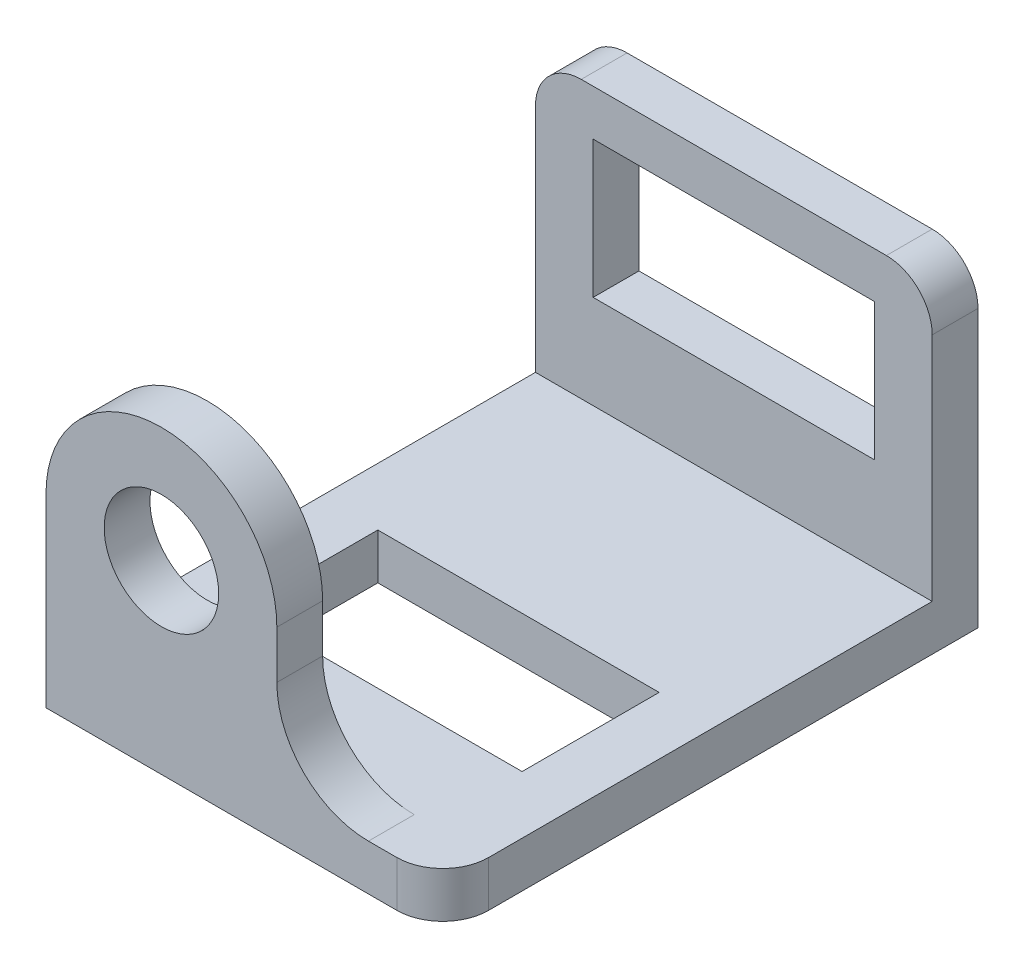
ISO-10303-21;
HEADER;
FILE_DESCRIPTION(('STEP AP214'),'2;1');
FILE_NAME('part.step','',(''),(''),'','','');
FILE_SCHEMA(('AUTOMOTIVE_DESIGN { 1 0 10303 214 1 1 1 1 }'));
ENDSEC;
DATA;
#1=APPLICATION_CONTEXT('core data for automotive mechanical design processes');
#2=APPLICATION_PROTOCOL_DEFINITION('international standard','automotive_design',2000,#1);
#3=PRODUCT_CONTEXT('',#1,'mechanical');
#4=PRODUCT('Part','Part','',(#3));
#5=PRODUCT_RELATED_PRODUCT_CATEGORY('part','',(#4));
#6=PRODUCT_DEFINITION_FORMATION('','',#4);
#7=PRODUCT_DEFINITION_CONTEXT('part definition',#1,'design');
#8=PRODUCT_DEFINITION('design','',#6,#7);
#9=PRODUCT_DEFINITION_SHAPE('','',#8);
#10=(LENGTH_UNIT() NAMED_UNIT(*) SI_UNIT(.MILLI.,.METRE.));
#11=(NAMED_UNIT(*) PLANE_ANGLE_UNIT() SI_UNIT($,.RADIAN.));
#12=(NAMED_UNIT(*) SI_UNIT($,.STERADIAN.) SOLID_ANGLE_UNIT());
#13=UNCERTAINTY_MEASURE_WITH_UNIT(LENGTH_MEASURE(1.E-05),#10,'distance_accuracy_value','');
#14=(GEOMETRIC_REPRESENTATION_CONTEXT(3) GLOBAL_UNCERTAINTY_ASSIGNED_CONTEXT((#13)) GLOBAL_UNIT_ASSIGNED_CONTEXT((#10,
#11,#12)) REPRESENTATION_CONTEXT('',''));
#15=CARTESIAN_POINT('',(0.,0.,0.));
#16=DIRECTION('',(0.,0.,1.));
#17=DIRECTION('',(1.,0.,0.));
#18=AXIS2_PLACEMENT_3D('',#15,#16,#17);
#19=CARTESIAN_POINT('',(0.,6.35,0.));
#20=DIRECTION('',(0.,-1.,0.));
#21=DIRECTION('',(0.,0.,-1.));
#22=AXIS2_PLACEMENT_3D('',#19,#20,#21);
#23=PLANE('',#22);
#24=DIRECTION('',(1.,0.,0.));
#25=VECTOR('',#24,1.);
#26=CARTESIAN_POINT('',(-27.5,6.35,28.5));
#27=LINE('',#26,#25);
#28=CARTESIAN_POINT('',(17.2,6.35,28.5));
#29=VERTEX_POINT('',#28);
#30=CARTESIAN_POINT('',(21.15,6.35,28.5));
#31=VERTEX_POINT('',#30);
#32=EDGE_CURVE('E330',#29,#31,#27,.T.);
#33=ORIENTED_EDGE('',*,*,#32,.T.);
#34=CARTESIAN_POINT('',(21.15,6.35,22.15));
#35=DIRECTION('',(0.,-1.,0.));
#36=DIRECTION('',(0.,0.,-1.));
#37=AXIS2_PLACEMENT_3D('',#34,#35,#36);
#38=CIRCLE('',#37,6.35);
#39=CARTESIAN_POINT('',(27.5,6.35,22.15));
#40=VERTEX_POINT('',#39);
#41=EDGE_CURVE('E70',#31,#40,#38,.F.);
#42=ORIENTED_EDGE('',*,*,#41,.T.);
#43=DIRECTION('',(0.,0.,-1.));
#44=VECTOR('',#43,1.);
#45=CARTESIAN_POINT('',(27.5,6.35,28.5));
#46=LINE('',#45,#44);
#47=CARTESIAN_POINT('',(27.5,6.35,-39.352));
#48=VERTEX_POINT('',#47);
#49=EDGE_CURVE('E325',#40,#48,#46,.T.);
#50=ORIENTED_EDGE('',*,*,#49,.T.);
#51=DIRECTION('',(-1.,0.,0.));
#52=VECTOR('',#51,1.);
#53=CARTESIAN_POINT('',(-27.5,6.35,-39.352));
#54=LINE('',#53,#52);
#55=CARTESIAN_POINT('',(-27.5,6.35,-39.352));
#56=VERTEX_POINT('',#55);
#57=EDGE_CURVE('E286',#48,#56,#54,.T.);
#58=ORIENTED_EDGE('',*,*,#57,.T.);
#59=DIRECTION('',(0.,0.,1.));
#60=VECTOR('',#59,1.);
#61=CARTESIAN_POINT('',(-27.5,6.35,28.5));
#62=LINE('',#61,#60);
#63=CARTESIAN_POINT('',(-27.5,6.35,22.15));
#64=VERTEX_POINT('',#63);
#65=EDGE_CURVE('E327',#56,#64,#62,.T.);
#66=ORIENTED_EDGE('',*,*,#65,.T.);
#67=DIRECTION('',(1.,0.,0.));
#68=VECTOR('',#67,1.);
#69=CARTESIAN_POINT('',(-27.5,6.35,22.15));
#70=LINE('',#69,#68);
#71=CARTESIAN_POINT('',(17.2,6.35,22.15));
#72=VERTEX_POINT('',#71);
#73=EDGE_CURVE('E229',#64,#72,#70,.T.);
#74=ORIENTED_EDGE('',*,*,#73,.T.);
#75=DIRECTION('',(0.,0.,1.));
#76=VECTOR('',#75,1.);
#77=CARTESIAN_POINT('',(17.2,6.35,0.));
#78=LINE('',#77,#76);
#79=EDGE_CURVE('E345',#72,#29,#78,.T.);
#80=ORIENTED_EDGE('',*,*,#79,.T.);
#81=EDGE_LOOP('',(#33,#42,#50,#58,#66,#74,#80));
#82=FACE_BOUND('',#81,.T.);
#83=DIRECTION('',(0.,0.,-1.));
#84=VECTOR('',#83,1.);
#85=CARTESIAN_POINT('',(19.5,6.35,9.5));
#86=LINE('',#85,#84);
#87=CARTESIAN_POINT('',(19.5,6.35,9.5));
#88=VERTEX_POINT('',#87);
#89=CARTESIAN_POINT('',(19.5,6.35,-9.5));
#90=VERTEX_POINT('',#89);
#91=EDGE_CURVE('E294',#88,#90,#86,.T.);
#92=ORIENTED_EDGE('',*,*,#91,.F.);
#93=DIRECTION('',(1.,0.,0.));
#94=VECTOR('',#93,1.);
#95=CARTESIAN_POINT('',(-19.5,6.35,9.5));
#96=LINE('',#95,#94);
#97=CARTESIAN_POINT('',(-19.5,6.35,9.5));
#98=VERTEX_POINT('',#97);
#99=EDGE_CURVE('E302',#98,#88,#96,.T.);
#100=ORIENTED_EDGE('',*,*,#99,.F.);
#101=DIRECTION('',(0.,0.,1.));
#102=VECTOR('',#101,1.);
#103=CARTESIAN_POINT('',(-19.5,6.35,9.5));
#104=LINE('',#103,#102);
#105=CARTESIAN_POINT('',(-19.5,6.35,-9.5));
#106=VERTEX_POINT('',#105);
#107=EDGE_CURVE('E299',#106,#98,#104,.T.);
#108=ORIENTED_EDGE('',*,*,#107,.F.);
#109=DIRECTION('',(-1.,0.,0.));
#110=VECTOR('',#109,1.);
#111=CARTESIAN_POINT('',(-19.5,6.35,-9.5));
#112=LINE('',#111,#110);
#113=EDGE_CURVE('E296',#90,#106,#112,.T.);
#114=ORIENTED_EDGE('',*,*,#113,.F.);
#115=EDGE_LOOP('',(#92,#100,#108,#114));
#116=FACE_BOUND('',#115,.T.);
#117=ADVANCED_FACE('F62',(#82,#116),#23,.F.);
#118=CARTESIAN_POINT('',(0.,0.,0.));
#119=DIRECTION('',(0.,-1.,0.));
#120=DIRECTION('',(0.,0.,-1.));
#121=AXIS2_PLACEMENT_3D('',#118,#119,#120);
#122=PLANE('',#121);
#123=DIRECTION('',(0.,0.,-1.));
#124=VECTOR('',#123,1.);
#125=CARTESIAN_POINT('',(27.5,0.,28.5));
#126=LINE('',#125,#124);
#127=CARTESIAN_POINT('',(27.5,0.,22.15));
#128=VERTEX_POINT('',#127);
#129=CARTESIAN_POINT('',(27.5,0.,-45.702));
#130=VERTEX_POINT('',#129);
#131=EDGE_CURVE('E324',#128,#130,#126,.T.);
#132=ORIENTED_EDGE('',*,*,#131,.F.);
#133=CARTESIAN_POINT('',(21.15,0.,22.15));
#134=DIRECTION('',(0.,-1.,0.));
#135=DIRECTION('',(0.,0.,-1.));
#136=AXIS2_PLACEMENT_3D('',#133,#134,#135);
#137=CIRCLE('',#136,6.35);
#138=CARTESIAN_POINT('',(21.15,0.,28.5));
#139=VERTEX_POINT('',#138);
#140=EDGE_CURVE('E85',#128,#139,#137,.T.);
#141=ORIENTED_EDGE('',*,*,#140,.T.);
#142=DIRECTION('',(1.,0.,0.));
#143=VECTOR('',#142,1.);
#144=CARTESIAN_POINT('',(-27.5,0.,28.5));
#145=LINE('',#144,#143);
#146=CARTESIAN_POINT('',(-27.5,0.,28.5));
#147=VERTEX_POINT('',#146);
#148=EDGE_CURVE('E328',#147,#139,#145,.T.);
#149=ORIENTED_EDGE('',*,*,#148,.F.);
#150=DIRECTION('',(0.,0.,1.));
#151=VECTOR('',#150,1.);
#152=CARTESIAN_POINT('',(-27.5,0.,28.5));
#153=LINE('',#152,#151);
#154=CARTESIAN_POINT('',(-27.5,0.,-45.702));
#155=VERTEX_POINT('',#154);
#156=EDGE_CURVE('E336',#155,#147,#153,.T.);
#157=ORIENTED_EDGE('',*,*,#156,.F.);
#158=DIRECTION('',(-1.,0.,0.));
#159=VECTOR('',#158,1.);
#160=CARTESIAN_POINT('',(-27.5,0.,-45.702));
#161=LINE('',#160,#159);
#162=EDGE_CURVE('E333',#130,#155,#161,.T.);
#163=ORIENTED_EDGE('',*,*,#162,.F.);
#164=EDGE_LOOP('',(#132,#141,#149,#157,#163));
#165=FACE_BOUND('',#164,.T.);
#166=DIRECTION('',(1.,0.,0.));
#167=VECTOR('',#166,1.);
#168=CARTESIAN_POINT('',(-19.5,0.,9.5));
#169=LINE('',#168,#167);
#170=CARTESIAN_POINT('',(-19.5,0.,9.5));
#171=VERTEX_POINT('',#170);
#172=CARTESIAN_POINT('',(19.5,0.,9.5));
#173=VERTEX_POINT('',#172);
#174=EDGE_CURVE('E297',#171,#173,#169,.T.);
#175=ORIENTED_EDGE('',*,*,#174,.T.);
#176=DIRECTION('',(0.,0.,-1.));
#177=VECTOR('',#176,1.);
#178=CARTESIAN_POINT('',(19.5,0.,9.5));
#179=LINE('',#178,#177);
#180=CARTESIAN_POINT('',(19.5,0.,-9.5));
#181=VERTEX_POINT('',#180);
#182=EDGE_CURVE('E291',#173,#181,#179,.T.);
#183=ORIENTED_EDGE('',*,*,#182,.T.);
#184=DIRECTION('',(-1.,0.,0.));
#185=VECTOR('',#184,1.);
#186=CARTESIAN_POINT('',(-19.5,0.,-9.5));
#187=LINE('',#186,#185);
#188=CARTESIAN_POINT('',(-19.5,0.,-9.5));
#189=VERTEX_POINT('',#188);
#190=EDGE_CURVE('E307',#181,#189,#187,.T.);
#191=ORIENTED_EDGE('',*,*,#190,.T.);
#192=DIRECTION('',(0.,0.,1.));
#193=VECTOR('',#192,1.);
#194=CARTESIAN_POINT('',(-19.5,0.,9.5));
#195=LINE('',#194,#193);
#196=EDGE_CURVE('E310',#189,#171,#195,.T.);
#197=ORIENTED_EDGE('',*,*,#196,.T.);
#198=EDGE_LOOP('',(#175,#183,#191,#197));
#199=FACE_BOUND('',#198,.T.);
#200=ADVANCED_FACE('F396',(#165,#199),#122,.T.);
#201=CARTESIAN_POINT('',(27.5,6.35,28.5));
#202=DIRECTION('',(-1.,0.,0.));
#203=DIRECTION('',(0.,0.,1.));
#204=AXIS2_PLACEMENT_3D('',#201,#202,#203);
#205=PLANE('',#204);
#206=DIRECTION('',(0.,-1.,0.));
#207=VECTOR('',#206,1.);
#208=CARTESIAN_POINT('',(27.5,6.35,-45.702));
#209=LINE('',#208,#207);
#210=CARTESIAN_POINT('',(27.5,38.35,-45.702));
#211=VERTEX_POINT('',#210);
#212=EDGE_CURVE('E342',#211,#130,#209,.T.);
#213=ORIENTED_EDGE('',*,*,#212,.F.);
#214=DIRECTION('',(0.,0.,-1.));
#215=VECTOR('',#214,1.);
#216=CARTESIAN_POINT('',(27.5,38.35,-39.352));
#217=LINE('',#216,#215);
#218=CARTESIAN_POINT('',(27.5,38.35,-39.352));
#219=VERTEX_POINT('',#218);
#220=EDGE_CURVE('E366',#211,#219,#217,.F.);
#221=ORIENTED_EDGE('',*,*,#220,.T.);
#222=DIRECTION('',(0.,1.,0.));
#223=VECTOR('',#222,1.);
#224=CARTESIAN_POINT('',(27.5,6.34999999999999,-39.352));
#225=LINE('',#224,#223);
#226=EDGE_CURVE('E283',#48,#219,#225,.T.);
#227=ORIENTED_EDGE('',*,*,#226,.F.);
#228=ORIENTED_EDGE('',*,*,#49,.F.);
#229=DIRECTION('',(0.,-1.,0.));
#230=VECTOR('',#229,1.);
#231=CARTESIAN_POINT('',(27.5,6.35,22.15));
#232=LINE('',#231,#230);
#233=EDGE_CURVE('E363',#40,#128,#232,.T.);
#234=ORIENTED_EDGE('',*,*,#233,.T.);
#235=ORIENTED_EDGE('',*,*,#131,.T.);
#236=EDGE_LOOP('',(#213,#221,#227,#228,#234,#235));
#237=FACE_BOUND('',#236,.T.);
#238=ADVANCED_FACE('F382',(#237),#205,.F.);
#239=CARTESIAN_POINT('',(-27.5,6.35,-45.702));
#240=DIRECTION('',(0.,0.,1.));
#241=DIRECTION('',(1.,0.,0.));
#242=AXIS2_PLACEMENT_3D('',#239,#240,#241);
#243=PLANE('',#242);
#244=DIRECTION('',(1.,0.,0.));
#245=VECTOR('',#244,1.);
#246=CARTESIAN_POINT('',(-27.5,44.7,-45.702));
#247=LINE('',#246,#245);
#248=CARTESIAN_POINT('',(-21.15,44.7,-45.702));
#249=VERTEX_POINT('',#248);
#250=CARTESIAN_POINT('',(21.15,44.7,-45.702));
#251=VERTEX_POINT('',#250);
#252=EDGE_CURVE('E279',#249,#251,#247,.T.);
#253=ORIENTED_EDGE('',*,*,#252,.T.);
#254=CARTESIAN_POINT('',(21.15,38.35,-45.702));
#255=DIRECTION('',(0.,0.,1.));
#256=DIRECTION('',(1.,0.,0.));
#257=AXIS2_PLACEMENT_3D('',#254,#255,#256);
#258=CIRCLE('',#257,6.35);
#259=EDGE_CURVE('E361',#251,#211,#258,.F.);
#260=ORIENTED_EDGE('',*,*,#259,.T.);
#261=ORIENTED_EDGE('',*,*,#212,.T.);
#262=ORIENTED_EDGE('',*,*,#162,.T.);
#263=DIRECTION('',(0.,-1.,0.));
#264=VECTOR('',#263,1.);
#265=CARTESIAN_POINT('',(-27.5,6.35,-45.702));
#266=LINE('',#265,#264);
#267=CARTESIAN_POINT('',(-27.5,38.35,-45.702));
#268=VERTEX_POINT('',#267);
#269=EDGE_CURVE('E340',#268,#155,#266,.T.);
#270=ORIENTED_EDGE('',*,*,#269,.F.);
#271=CARTESIAN_POINT('',(-21.15,38.35,-45.702));
#272=DIRECTION('',(0.,0.,1.));
#273=DIRECTION('',(1.,0.,0.));
#274=AXIS2_PLACEMENT_3D('',#271,#272,#273);
#275=CIRCLE('',#274,6.35);
#276=EDGE_CURVE('E359',#268,#249,#275,.F.);
#277=ORIENTED_EDGE('',*,*,#276,.T.);
#278=EDGE_LOOP('',(#253,#260,#261,#262,#270,#277));
#279=FACE_BOUND('',#278,.T.);
#280=DIRECTION('',(0.,1.,0.));
#281=VECTOR('',#280,1.);
#282=CARTESIAN_POINT('',(19.5,6.35,-45.702));
#283=LINE('',#282,#281);
#284=CARTESIAN_POINT('',(19.5,19.35,-45.702));
#285=VERTEX_POINT('',#284);
#286=CARTESIAN_POINT('',(19.5,38.35,-45.702));
#287=VERTEX_POINT('',#286);
#288=EDGE_CURVE('E246',#285,#287,#283,.T.);
#289=ORIENTED_EDGE('',*,*,#288,.T.);
#290=DIRECTION('',(-1.,0.,0.));
#291=VECTOR('',#290,1.);
#292=CARTESIAN_POINT('',(-27.5,38.35,-45.702));
#293=LINE('',#292,#291);
#294=CARTESIAN_POINT('',(-19.5,38.35,-45.702));
#295=VERTEX_POINT('',#294);
#296=EDGE_CURVE('E262',#287,#295,#293,.T.);
#297=ORIENTED_EDGE('',*,*,#296,.T.);
#298=DIRECTION('',(0.,1.,0.));
#299=VECTOR('',#298,1.);
#300=CARTESIAN_POINT('',(-19.5,6.35,-45.702));
#301=LINE('',#300,#299);
#302=CARTESIAN_POINT('',(-19.5,19.35,-45.702));
#303=VERTEX_POINT('',#302);
#304=EDGE_CURVE('E265',#303,#295,#301,.T.);
#305=ORIENTED_EDGE('',*,*,#304,.F.);
#306=DIRECTION('',(-1.,0.,0.));
#307=VECTOR('',#306,1.);
#308=CARTESIAN_POINT('',(-27.5,19.35,-45.702));
#309=LINE('',#308,#307);
#310=EDGE_CURVE('E251',#285,#303,#309,.T.);
#311=ORIENTED_EDGE('',*,*,#310,.F.);
#312=EDGE_LOOP('',(#289,#297,#305,#311));
#313=FACE_BOUND('',#312,.T.);
#314=ADVANCED_FACE('F411',(#279,#313),#243,.F.);
#315=CARTESIAN_POINT('',(-27.5,6.35,28.5));
#316=DIRECTION('',(1.,0.,0.));
#317=DIRECTION('',(0.,0.,-1.));
#318=AXIS2_PLACEMENT_3D('',#315,#316,#317);
#319=PLANE('',#318);
#320=DIRECTION('',(0.,1.,0.));
#321=VECTOR('',#320,1.);
#322=CARTESIAN_POINT('',(-27.5,6.35,-39.352));
#323=LINE('',#322,#321);
#324=CARTESIAN_POINT('',(-27.5,38.35,-39.352));
#325=VERTEX_POINT('',#324);
#326=EDGE_CURVE('E289',#56,#325,#323,.T.);
#327=ORIENTED_EDGE('',*,*,#326,.T.);
#328=DIRECTION('',(0.,0.,-1.));
#329=VECTOR('',#328,1.);
#330=CARTESIAN_POINT('',(-27.5,38.35,-45.702));
#331=LINE('',#330,#329);
#332=EDGE_CURVE('E12',#325,#268,#331,.T.);
#333=ORIENTED_EDGE('',*,*,#332,.T.);
#334=ORIENTED_EDGE('',*,*,#269,.T.);
#335=ORIENTED_EDGE('',*,*,#156,.T.);
#336=DIRECTION('',(0.,-1.,0.));
#337=VECTOR('',#336,1.);
#338=CARTESIAN_POINT('',(-27.5,6.35,28.5));
#339=LINE('',#338,#337);
#340=CARTESIAN_POINT('',(-27.5,25.68,28.5));
#341=VERTEX_POINT('',#340);
#342=EDGE_CURVE('E214',#341,#147,#339,.T.);
#343=ORIENTED_EDGE('',*,*,#342,.F.);
#344=DIRECTION('',(0.,0.,1.));
#345=VECTOR('',#344,1.);
#346=CARTESIAN_POINT('',(-27.5,25.68,22.15));
#347=LINE('',#346,#345);
#348=CARTESIAN_POINT('',(-27.5,25.68,22.15));
#349=VERTEX_POINT('',#348);
#350=EDGE_CURVE('E207',#349,#341,#347,.T.);
#351=ORIENTED_EDGE('',*,*,#350,.F.);
#352=DIRECTION('',(0.,-1.,0.));
#353=VECTOR('',#352,1.);
#354=CARTESIAN_POINT('',(-27.5,25.68,22.15));
#355=LINE('',#354,#353);
#356=EDGE_CURVE('E212',#349,#64,#355,.T.);
#357=ORIENTED_EDGE('',*,*,#356,.T.);
#358=ORIENTED_EDGE('',*,*,#65,.F.);
#359=EDGE_LOOP('',(#327,#333,#334,#335,#343,#351,#357,#358));
#360=FACE_BOUND('',#359,.T.);
#361=ADVANCED_FACE('F210',(#360),#319,.F.);
#362=CARTESIAN_POINT('',(-27.5,6.35,28.5));
#363=DIRECTION('',(0.,0.,-1.));
#364=DIRECTION('',(-1.,0.,0.));
#365=AXIS2_PLACEMENT_3D('',#362,#363,#364);
#366=PLANE('',#365);
#367=ORIENTED_EDGE('',*,*,#148,.T.);
#368=DIRECTION('',(0.,-1.,0.));
#369=VECTOR('',#368,1.);
#370=CARTESIAN_POINT('',(21.15,6.35,28.5));
#371=LINE('',#370,#369);
#372=EDGE_CURVE('E77',#139,#31,#371,.F.);
#373=ORIENTED_EDGE('',*,*,#372,.T.);
#374=ORIENTED_EDGE('',*,*,#32,.F.);
#375=CARTESIAN_POINT('',(17.2,19.05,28.5));
#376=DIRECTION('',(0.,0.,-1.));
#377=DIRECTION('',(-1.,0.,0.));
#378=AXIS2_PLACEMENT_3D('',#375,#376,#377);
#379=CIRCLE('',#378,12.7);
#380=CARTESIAN_POINT('',(4.5,19.05,28.5));
#381=VERTEX_POINT('',#380);
#382=EDGE_CURVE('E350',#29,#381,#379,.T.);
#383=ORIENTED_EDGE('',*,*,#382,.T.);
#384=DIRECTION('',(0.,1.,0.));
#385=VECTOR('',#384,1.);
#386=CARTESIAN_POINT('',(4.5,25.68,28.5));
#387=LINE('',#386,#385);
#388=CARTESIAN_POINT('',(4.5,25.68,28.5));
#389=VERTEX_POINT('',#388);
#390=EDGE_CURVE('E234',#381,#389,#387,.T.);
#391=ORIENTED_EDGE('',*,*,#390,.T.);
#392=CARTESIAN_POINT('',(-11.5,25.68,28.5));
#393=DIRECTION('',(0.,0.,1.));
#394=DIRECTION('',(1.,0.,0.));
#395=AXIS2_PLACEMENT_3D('',#392,#393,#394);
#396=CIRCLE('',#395,16.);
#397=EDGE_CURVE('E236',#389,#341,#396,.T.);
#398=ORIENTED_EDGE('',*,*,#397,.T.);
#399=ORIENTED_EDGE('',*,*,#342,.T.);
#400=EDGE_LOOP('',(#367,#373,#374,#383,#391,#398,#399));
#401=FACE_BOUND('',#400,.T.);
#402=CARTESIAN_POINT('',(-11.5,25.68,28.5));
#403=DIRECTION('',(0.,0.,1.));
#404=DIRECTION('',(1.,0.,0.));
#405=AXIS2_PLACEMENT_3D('',#402,#403,#404);
#406=CIRCLE('',#405,7.9375);
#407=CARTESIAN_POINT('',(-3.5625,25.68,28.5));
#408=VERTEX_POINT('',#407);
#409=EDGE_CURVE('E239',#408,#408,#406,.T.);
#410=ORIENTED_EDGE('',*,*,#409,.F.);
#411=EDGE_LOOP('',(#410));
#412=FACE_BOUND('',#411,.T.);
#413=ADVANCED_FACE('F406',(#401,#412),#366,.F.);
#414=CARTESIAN_POINT('',(19.5,6.35,9.5));
#415=DIRECTION('',(-1.,0.,0.));
#416=DIRECTION('',(0.,0.,1.));
#417=AXIS2_PLACEMENT_3D('',#414,#415,#416);
#418=PLANE('',#417);
#419=ORIENTED_EDGE('',*,*,#182,.F.);
#420=DIRECTION('',(0.,-1.,0.));
#421=VECTOR('',#420,1.);
#422=CARTESIAN_POINT('',(19.5,6.35,9.5));
#423=LINE('',#422,#421);
#424=EDGE_CURVE('E304',#88,#173,#423,.T.);
#425=ORIENTED_EDGE('',*,*,#424,.F.);
#426=ORIENTED_EDGE('',*,*,#91,.T.);
#427=DIRECTION('',(0.,-1.,0.));
#428=VECTOR('',#427,1.);
#429=CARTESIAN_POINT('',(19.5,6.35,-9.5));
#430=LINE('',#429,#428);
#431=EDGE_CURVE('E321',#90,#181,#430,.T.);
#432=ORIENTED_EDGE('',*,*,#431,.T.);
#433=EDGE_LOOP('',(#419,#425,#426,#432));
#434=FACE_BOUND('',#433,.T.);
#435=ADVANCED_FACE('F403',(#434),#418,.T.);
#436=CARTESIAN_POINT('',(-19.5,6.35,-9.5));
#437=DIRECTION('',(0.,0.,1.));
#438=DIRECTION('',(1.,0.,0.));
#439=AXIS2_PLACEMENT_3D('',#436,#437,#438);
#440=PLANE('',#439);
#441=ORIENTED_EDGE('',*,*,#190,.F.);
#442=ORIENTED_EDGE('',*,*,#431,.F.);
#443=ORIENTED_EDGE('',*,*,#113,.T.);
#444=DIRECTION('',(0.,-1.,0.));
#445=VECTOR('',#444,1.);
#446=CARTESIAN_POINT('',(-19.5,6.35,-9.5));
#447=LINE('',#446,#445);
#448=EDGE_CURVE('E319',#106,#189,#447,.T.);
#449=ORIENTED_EDGE('',*,*,#448,.T.);
#450=EDGE_LOOP('',(#441,#442,#443,#449));
#451=FACE_BOUND('',#450,.T.);
#452=ADVANCED_FACE('F461',(#451),#440,.T.);
#453=CARTESIAN_POINT('',(-19.5,6.35,9.5));
#454=DIRECTION('',(1.,0.,0.));
#455=DIRECTION('',(0.,0.,-1.));
#456=AXIS2_PLACEMENT_3D('',#453,#454,#455);
#457=PLANE('',#456);
#458=ORIENTED_EDGE('',*,*,#196,.F.);
#459=ORIENTED_EDGE('',*,*,#448,.F.);
#460=ORIENTED_EDGE('',*,*,#107,.T.);
#461=DIRECTION('',(0.,-1.,0.));
#462=VECTOR('',#461,1.);
#463=CARTESIAN_POINT('',(-19.5,6.35,9.5));
#464=LINE('',#463,#462);
#465=EDGE_CURVE('E317',#98,#171,#464,.T.);
#466=ORIENTED_EDGE('',*,*,#465,.T.);
#467=EDGE_LOOP('',(#458,#459,#460,#466));
#468=FACE_BOUND('',#467,.T.);
#469=ADVANCED_FACE('F463',(#468),#457,.T.);
#470=CARTESIAN_POINT('',(-19.5,6.35,9.5));
#471=DIRECTION('',(0.,0.,-1.));
#472=DIRECTION('',(-1.,0.,0.));
#473=AXIS2_PLACEMENT_3D('',#470,#471,#472);
#474=PLANE('',#473);
#475=ORIENTED_EDGE('',*,*,#174,.F.);
#476=ORIENTED_EDGE('',*,*,#465,.F.);
#477=ORIENTED_EDGE('',*,*,#99,.T.);
#478=ORIENTED_EDGE('',*,*,#424,.T.);
#479=EDGE_LOOP('',(#475,#476,#477,#478));
#480=FACE_BOUND('',#479,.T.);
#481=ADVANCED_FACE('F451',(#480),#474,.T.);
#482=CARTESIAN_POINT('',(0.,0.,-39.352));
#483=DIRECTION('',(0.,0.,1.));
#484=DIRECTION('',(1.,0.,0.));
#485=AXIS2_PLACEMENT_3D('',#482,#483,#484);
#486=PLANE('',#485);
#487=ORIENTED_EDGE('',*,*,#226,.T.);
#488=CARTESIAN_POINT('',(21.15,38.35,-39.352));
#489=DIRECTION('',(0.,0.,1.));
#490=DIRECTION('',(1.,0.,0.));
#491=AXIS2_PLACEMENT_3D('',#488,#489,#490);
#492=CIRCLE('',#491,6.35);
#493=CARTESIAN_POINT('',(21.15,44.7,-39.352));
#494=VERTEX_POINT('',#493);
#495=EDGE_CURVE('E370',#219,#494,#492,.T.);
#496=ORIENTED_EDGE('',*,*,#495,.T.);
#497=DIRECTION('',(1.,0.,0.));
#498=VECTOR('',#497,1.);
#499=CARTESIAN_POINT('',(-27.5,44.7,-39.352));
#500=LINE('',#499,#498);
#501=CARTESIAN_POINT('',(-21.15,44.7,-39.352));
#502=VERTEX_POINT('',#501);
#503=EDGE_CURVE('E280',#502,#494,#500,.T.);
#504=ORIENTED_EDGE('',*,*,#503,.F.);
#505=CARTESIAN_POINT('',(-21.15,38.35,-39.352));
#506=DIRECTION('',(0.,0.,1.));
#507=DIRECTION('',(1.,0.,0.));
#508=AXIS2_PLACEMENT_3D('',#505,#506,#507);
#509=CIRCLE('',#508,6.35);
#510=EDGE_CURVE('E368',#502,#325,#509,.T.);
#511=ORIENTED_EDGE('',*,*,#510,.T.);
#512=ORIENTED_EDGE('',*,*,#326,.F.);
#513=ORIENTED_EDGE('',*,*,#57,.F.);
#514=EDGE_LOOP('',(#487,#496,#504,#511,#512,#513));
#515=FACE_BOUND('',#514,.T.);
#516=DIRECTION('',(-1.,0.,0.));
#517=VECTOR('',#516,1.);
#518=CARTESIAN_POINT('',(-27.5,38.35,-39.352));
#519=LINE('',#518,#517);
#520=CARTESIAN_POINT('',(19.5,38.35,-39.352));
#521=VERTEX_POINT('',#520);
#522=CARTESIAN_POINT('',(-19.5,38.35,-39.352));
#523=VERTEX_POINT('',#522);
#524=EDGE_CURVE('E250',#521,#523,#519,.T.);
#525=ORIENTED_EDGE('',*,*,#524,.F.);
#526=DIRECTION('',(0.,1.,0.));
#527=VECTOR('',#526,1.);
#528=CARTESIAN_POINT('',(19.5,6.35,-39.352));
#529=LINE('',#528,#527);
#530=CARTESIAN_POINT('',(19.5,19.35,-39.352));
#531=VERTEX_POINT('',#530);
#532=EDGE_CURVE('E248',#531,#521,#529,.T.);
#533=ORIENTED_EDGE('',*,*,#532,.F.);
#534=DIRECTION('',(-1.,0.,0.));
#535=VECTOR('',#534,1.);
#536=CARTESIAN_POINT('',(-27.5,19.35,-39.352));
#537=LINE('',#536,#535);
#538=CARTESIAN_POINT('',(-19.5,19.35,-39.352));
#539=VERTEX_POINT('',#538);
#540=EDGE_CURVE('E256',#531,#539,#537,.T.);
#541=ORIENTED_EDGE('',*,*,#540,.T.);
#542=DIRECTION('',(0.,1.,0.));
#543=VECTOR('',#542,1.);
#544=CARTESIAN_POINT('',(-19.5,6.35,-39.352));
#545=LINE('',#544,#543);
#546=EDGE_CURVE('E253',#539,#523,#545,.T.);
#547=ORIENTED_EDGE('',*,*,#546,.T.);
#548=EDGE_LOOP('',(#525,#533,#541,#547));
#549=FACE_BOUND('',#548,.T.);
#550=ADVANCED_FACE('F470',(#515,#549),#486,.T.);
#551=CARTESIAN_POINT('',(-27.5,44.7,-39.352));
#552=DIRECTION('',(0.,1.,0.));
#553=DIRECTION('',(-1.,0.,0.));
#554=AXIS2_PLACEMENT_3D('',#551,#552,#553);
#555=PLANE('',#554);
#556=ORIENTED_EDGE('',*,*,#503,.T.);
#557=DIRECTION('',(0.,0.,-1.));
#558=VECTOR('',#557,1.);
#559=CARTESIAN_POINT('',(21.15,44.7,-45.702));
#560=LINE('',#559,#558);
#561=EDGE_CURVE('E356',#494,#251,#560,.T.);
#562=ORIENTED_EDGE('',*,*,#561,.T.);
#563=ORIENTED_EDGE('',*,*,#252,.F.);
#564=DIRECTION('',(0.,0.,-1.));
#565=VECTOR('',#564,1.);
#566=CARTESIAN_POINT('',(-21.15,44.7,-39.352));
#567=LINE('',#566,#565);
#568=EDGE_CURVE('E354',#249,#502,#567,.F.);
#569=ORIENTED_EDGE('',*,*,#568,.T.);
#570=EDGE_LOOP('',(#556,#562,#563,#569));
#571=FACE_BOUND('',#570,.T.);
#572=ADVANCED_FACE('F440',(#571),#555,.T.);
#573=CARTESIAN_POINT('',(19.5,6.35,-39.352));
#574=DIRECTION('',(-1.,0.,0.));
#575=DIRECTION('',(0.,0.,1.));
#576=AXIS2_PLACEMENT_3D('',#573,#574,#575);
#577=PLANE('',#576);
#578=ORIENTED_EDGE('',*,*,#288,.F.);
#579=DIRECTION('',(0.,0.,-1.));
#580=VECTOR('',#579,1.);
#581=CARTESIAN_POINT('',(19.5,19.35,-39.352));
#582=LINE('',#581,#580);
#583=EDGE_CURVE('E259',#531,#285,#582,.T.);
#584=ORIENTED_EDGE('',*,*,#583,.F.);
#585=ORIENTED_EDGE('',*,*,#532,.T.);
#586=DIRECTION('',(0.,0.,-1.));
#587=VECTOR('',#586,1.);
#588=CARTESIAN_POINT('',(19.5,38.35,-39.352));
#589=LINE('',#588,#587);
#590=EDGE_CURVE('E276',#521,#287,#589,.T.);
#591=ORIENTED_EDGE('',*,*,#590,.T.);
#592=EDGE_LOOP('',(#578,#584,#585,#591));
#593=FACE_BOUND('',#592,.T.);
#594=ADVANCED_FACE('F475',(#593),#577,.T.);
#595=CARTESIAN_POINT('',(-27.5,38.35,-39.352));
#596=DIRECTION('',(0.,-1.,0.));
#597=DIRECTION('',(1.,0.,0.));
#598=AXIS2_PLACEMENT_3D('',#595,#596,#597);
#599=PLANE('',#598);
#600=ORIENTED_EDGE('',*,*,#296,.F.);
#601=ORIENTED_EDGE('',*,*,#590,.F.);
#602=ORIENTED_EDGE('',*,*,#524,.T.);
#603=DIRECTION('',(0.,0.,-1.));
#604=VECTOR('',#603,1.);
#605=CARTESIAN_POINT('',(-19.5,38.35,-39.352));
#606=LINE('',#605,#604);
#607=EDGE_CURVE('E274',#523,#295,#606,.T.);
#608=ORIENTED_EDGE('',*,*,#607,.T.);
#609=EDGE_LOOP('',(#600,#601,#602,#608));
#610=FACE_BOUND('',#609,.T.);
#611=ADVANCED_FACE('F480',(#610),#599,.T.);
#612=CARTESIAN_POINT('',(-19.5,6.35,-39.352));
#613=DIRECTION('',(-1.,0.,0.));
#614=DIRECTION('',(0.,-1.,0.));
#615=AXIS2_PLACEMENT_3D('',#612,#613,#614);
#616=PLANE('',#615);
#617=ORIENTED_EDGE('',*,*,#304,.T.);
#618=ORIENTED_EDGE('',*,*,#607,.F.);
#619=ORIENTED_EDGE('',*,*,#546,.F.);
#620=DIRECTION('',(0.,0.,-1.));
#621=VECTOR('',#620,1.);
#622=CARTESIAN_POINT('',(-19.5,19.35,-39.352));
#623=LINE('',#622,#621);
#624=EDGE_CURVE('E272',#539,#303,#623,.T.);
#625=ORIENTED_EDGE('',*,*,#624,.T.);
#626=EDGE_LOOP('',(#617,#618,#619,#625));
#627=FACE_BOUND('',#626,.T.);
#628=ADVANCED_FACE('F484',(#627),#616,.F.);
#629=CARTESIAN_POINT('',(-27.5,19.35,-39.352));
#630=DIRECTION('',(0.,-1.,0.));
#631=DIRECTION('',(1.,0.,0.));
#632=AXIS2_PLACEMENT_3D('',#629,#630,#631);
#633=PLANE('',#632);
#634=ORIENTED_EDGE('',*,*,#310,.T.);
#635=ORIENTED_EDGE('',*,*,#624,.F.);
#636=ORIENTED_EDGE('',*,*,#540,.F.);
#637=ORIENTED_EDGE('',*,*,#583,.T.);
#638=EDGE_LOOP('',(#634,#635,#636,#637));
#639=FACE_BOUND('',#638,.T.);
#640=ADVANCED_FACE('F488',(#639),#633,.F.);
#641=CARTESIAN_POINT('',(-11.5,25.68,22.15));
#642=DIRECTION('',(0.,0.,1.));
#643=DIRECTION('',(1.,0.,0.));
#644=AXIS2_PLACEMENT_3D('',#641,#642,#643);
#645=CYLINDRICAL_SURFACE('',#644,16.);
#646=ORIENTED_EDGE('',*,*,#397,.F.);
#647=DIRECTION('',(0.,0.,1.));
#648=VECTOR('',#647,1.);
#649=CARTESIAN_POINT('',(4.5,25.68,22.15));
#650=LINE('',#649,#648);
#651=CARTESIAN_POINT('',(4.5,25.68,22.15));
#652=VERTEX_POINT('',#651);
#653=EDGE_CURVE('E219',#652,#389,#650,.T.);
#654=ORIENTED_EDGE('',*,*,#653,.F.);
#655=CARTESIAN_POINT('',(-11.5,25.68,22.15));
#656=DIRECTION('',(0.,0.,1.));
#657=DIRECTION('',(1.,0.,0.));
#658=AXIS2_PLACEMENT_3D('',#655,#656,#657);
#659=CIRCLE('',#658,16.);
#660=EDGE_CURVE('E227',#652,#349,#659,.T.);
#661=ORIENTED_EDGE('',*,*,#660,.T.);
#662=ORIENTED_EDGE('',*,*,#350,.T.);
#663=EDGE_LOOP('',(#646,#654,#661,#662));
#664=FACE_BOUND('',#663,.T.);
#665=ADVANCED_FACE('F232',(#664),#645,.T.);
#666=CARTESIAN_POINT('',(4.5,25.68,22.15));
#667=DIRECTION('',(1.,0.,0.));
#668=DIRECTION('',(0.,0.,-1.));
#669=AXIS2_PLACEMENT_3D('',#666,#667,#668);
#670=PLANE('',#669);
#671=ORIENTED_EDGE('',*,*,#390,.F.);
#672=DIRECTION('',(0.,0.,1.));
#673=VECTOR('',#672,1.);
#674=CARTESIAN_POINT('',(4.5,19.05,22.15));
#675=LINE('',#674,#673);
#676=CARTESIAN_POINT('',(4.5,19.05,22.15));
#677=VERTEX_POINT('',#676);
#678=EDGE_CURVE('E348',#381,#677,#675,.F.);
#679=ORIENTED_EDGE('',*,*,#678,.T.);
#680=DIRECTION('',(0.,1.,0.));
#681=VECTOR('',#680,1.);
#682=CARTESIAN_POINT('',(4.5,25.68,22.15));
#683=LINE('',#682,#681);
#684=EDGE_CURVE('E220',#677,#652,#683,.T.);
#685=ORIENTED_EDGE('',*,*,#684,.T.);
#686=ORIENTED_EDGE('',*,*,#653,.T.);
#687=EDGE_LOOP('',(#671,#679,#685,#686));
#688=FACE_BOUND('',#687,.T.);
#689=ADVANCED_FACE('F430',(#688),#670,.T.);
#690=CARTESIAN_POINT('',(-11.5,25.68,22.15));
#691=DIRECTION('',(0.,0.,1.));
#692=DIRECTION('',(1.,0.,0.));
#693=AXIS2_PLACEMENT_3D('',#690,#691,#692);
#694=PLANE('',#693);
#695=CARTESIAN_POINT('',(-11.5,25.68,22.15));
#696=DIRECTION('',(0.,0.,1.));
#697=DIRECTION('',(1.,0.,0.));
#698=AXIS2_PLACEMENT_3D('',#695,#696,#697);
#699=CIRCLE('',#698,7.9375);
#700=CARTESIAN_POINT('',(-3.5625,25.68,22.15));
#701=VERTEX_POINT('',#700);
#702=EDGE_CURVE('E244',#701,#701,#699,.T.);
#703=ORIENTED_EDGE('',*,*,#702,.T.);
#704=EDGE_LOOP('',(#703));
#705=FACE_BOUND('',#704,.T.);
#706=ORIENTED_EDGE('',*,*,#660,.F.);
#707=ORIENTED_EDGE('',*,*,#684,.F.);
#708=CARTESIAN_POINT('',(17.2,19.05,22.15));
#709=DIRECTION('',(0.,0.,1.));
#710=DIRECTION('',(1.,0.,0.));
#711=AXIS2_PLACEMENT_3D('',#708,#709,#710);
#712=CIRCLE('',#711,12.7);
#713=EDGE_CURVE('E352',#677,#72,#712,.T.);
#714=ORIENTED_EDGE('',*,*,#713,.T.);
#715=ORIENTED_EDGE('',*,*,#73,.F.);
#716=ORIENTED_EDGE('',*,*,#356,.F.);
#717=EDGE_LOOP('',(#706,#707,#714,#715,#716));
#718=FACE_BOUND('',#717,.T.);
#719=ADVANCED_FACE('F225',(#705,#718),#694,.F.);
#720=CARTESIAN_POINT('',(-11.5,25.68,22.15));
#721=DIRECTION('',(0.,0.,1.));
#722=DIRECTION('',(1.,0.,0.));
#723=AXIS2_PLACEMENT_3D('',#720,#721,#722);
#724=CYLINDRICAL_SURFACE('',#723,7.9375);
#725=ORIENTED_EDGE('',*,*,#702,.F.);
#726=EDGE_LOOP('',(#725));
#727=FACE_BOUND('',#726,.T.);
#728=ORIENTED_EDGE('',*,*,#409,.T.);
#729=EDGE_LOOP('',(#728));
#730=FACE_BOUND('',#729,.T.);
#731=ADVANCED_FACE('F418',(#727,#730),#724,.F.);
#732=CARTESIAN_POINT('',(17.2,19.05,0.));
#733=DIRECTION('',(0.,0.,1.));
#734=DIRECTION('',(1.,0.,0.));
#735=AXIS2_PLACEMENT_3D('',#732,#733,#734);
#736=CYLINDRICAL_SURFACE('',#735,12.7);
#737=ORIENTED_EDGE('',*,*,#713,.F.);
#738=ORIENTED_EDGE('',*,*,#678,.F.);
#739=ORIENTED_EDGE('',*,*,#382,.F.);
#740=ORIENTED_EDGE('',*,*,#79,.F.);
#741=EDGE_LOOP('',(#737,#738,#739,#740));
#742=FACE_BOUND('',#741,.T.);
#743=ADVANCED_FACE('F392',(#742),#736,.F.);
#744=CARTESIAN_POINT('',(21.15,38.35,-39.352));
#745=DIRECTION('',(0.,0.,1.));
#746=DIRECTION('',(1.,0.,0.));
#747=AXIS2_PLACEMENT_3D('',#744,#745,#746);
#748=CYLINDRICAL_SURFACE('',#747,6.35);
#749=ORIENTED_EDGE('',*,*,#495,.F.);
#750=ORIENTED_EDGE('',*,*,#220,.F.);
#751=ORIENTED_EDGE('',*,*,#259,.F.);
#752=ORIENTED_EDGE('',*,*,#561,.F.);
#753=EDGE_LOOP('',(#749,#750,#751,#752));
#754=FACE_BOUND('',#753,.T.);
#755=ADVANCED_FACE('F386',(#754),#748,.T.);
#756=CARTESIAN_POINT('',(21.15,6.35,22.15));
#757=DIRECTION('',(0.,-1.,0.));
#758=DIRECTION('',(0.,0.,-1.));
#759=AXIS2_PLACEMENT_3D('',#756,#757,#758);
#760=CYLINDRICAL_SURFACE('',#759,6.35);
#761=ORIENTED_EDGE('',*,*,#41,.F.);
#762=ORIENTED_EDGE('',*,*,#372,.F.);
#763=ORIENTED_EDGE('',*,*,#140,.F.);
#764=ORIENTED_EDGE('',*,*,#233,.F.);
#765=EDGE_LOOP('',(#761,#762,#763,#764));
#766=FACE_BOUND('',#765,.T.);
#767=ADVANCED_FACE('F384',(#766),#760,.T.);
#768=CARTESIAN_POINT('',(-21.15,38.35,28.5));
#769=DIRECTION('',(0.,0.,1.));
#770=DIRECTION('',(1.,0.,0.));
#771=AXIS2_PLACEMENT_3D('',#768,#769,#770);
#772=CYLINDRICAL_SURFACE('',#771,6.35);
#773=ORIENTED_EDGE('',*,*,#510,.F.);
#774=ORIENTED_EDGE('',*,*,#568,.F.);
#775=ORIENTED_EDGE('',*,*,#276,.F.);
#776=ORIENTED_EDGE('',*,*,#332,.F.);
#777=EDGE_LOOP('',(#773,#774,#775,#776));
#778=FACE_BOUND('',#777,.T.);
#779=ADVANCED_FACE('F64',(#778),#772,.T.);
#780=CLOSED_SHELL('',(#117,#200,#238,#314,#361,#413,#435,#452,#469,#481,#550,#572,#594,#611,
#628,#640,#665,#689,#719,#731,#743,#755,#767,#779));
#781=MANIFOLD_SOLID_BREP('B2',#780);
#782=ADVANCED_BREP_SHAPE_REPRESENTATION('',(#18,#781),#14);
#783=SHAPE_DEFINITION_REPRESENTATION(#9,#782);
ENDSEC;
END-ISO-10303-21;
